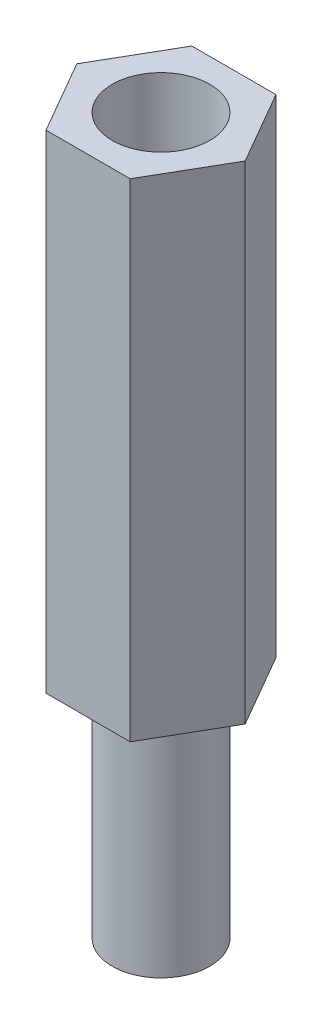
ISO-10303-21;
HEADER;
FILE_DESCRIPTION(('STEP AP214'),'2;1');
FILE_NAME('part.step','',(''),(''),'','','');
FILE_SCHEMA(('AUTOMOTIVE_DESIGN { 1 0 10303 214 1 1 1 1 }'));
ENDSEC;
DATA;
#1=APPLICATION_CONTEXT('core data for automotive mechanical design processes');
#2=APPLICATION_PROTOCOL_DEFINITION('international standard','automotive_design',2000,#1);
#3=PRODUCT_CONTEXT('',#1,'mechanical');
#4=PRODUCT('Part','Part','',(#3));
#5=PRODUCT_RELATED_PRODUCT_CATEGORY('part','',(#4));
#6=PRODUCT_DEFINITION_FORMATION('','',#4);
#7=PRODUCT_DEFINITION_CONTEXT('part definition',#1,'design');
#8=PRODUCT_DEFINITION('design','',#6,#7);
#9=PRODUCT_DEFINITION_SHAPE('','',#8);
#10=(LENGTH_UNIT() NAMED_UNIT(*) SI_UNIT(.MILLI.,.METRE.));
#11=(NAMED_UNIT(*) PLANE_ANGLE_UNIT() SI_UNIT($,.RADIAN.));
#12=(NAMED_UNIT(*) SI_UNIT($,.STERADIAN.) SOLID_ANGLE_UNIT());
#13=UNCERTAINTY_MEASURE_WITH_UNIT(LENGTH_MEASURE(1.E-05),#10,'distance_accuracy_value','');
#14=(GEOMETRIC_REPRESENTATION_CONTEXT(3) GLOBAL_UNCERTAINTY_ASSIGNED_CONTEXT((#13)) GLOBAL_UNIT_ASSIGNED_CONTEXT((#10,
#11,#12)) REPRESENTATION_CONTEXT('',''));
#15=CARTESIAN_POINT('',(0.,0.,0.));
#16=DIRECTION('',(0.,0.,1.));
#17=DIRECTION('',(1.,0.,0.));
#18=AXIS2_PLACEMENT_3D('',#15,#16,#17);
#19=CARTESIAN_POINT('',(0.,-7.,0.));
#20=DIRECTION('',(0.,1.,0.));
#21=DIRECTION('',(0.,0.,1.));
#22=AXIS2_PLACEMENT_3D('',#19,#20,#21);
#23=CYLINDRICAL_SURFACE('',#22,1.5);
#24=CARTESIAN_POINT('',(0.,-7.,0.));
#25=DIRECTION('',(0.,-1.,0.));
#26=DIRECTION('',(0.,0.,-1.));
#27=AXIS2_PLACEMENT_3D('',#24,#25,#26);
#28=CIRCLE('',#27,1.5);
#29=CARTESIAN_POINT('',(0.,-7.,-1.5));
#30=VERTEX_POINT('',#29);
#31=EDGE_CURVE('E11',#30,#30,#28,.T.);
#32=ORIENTED_EDGE('',*,*,#31,.F.);
#33=EDGE_LOOP('',(#32));
#34=FACE_BOUND('',#33,.T.);
#35=CARTESIAN_POINT('',(0.,0.,0.));
#36=DIRECTION('',(0.,-1.,0.));
#37=DIRECTION('',(0.,0.,-1.));
#38=AXIS2_PLACEMENT_3D('',#35,#36,#37);
#39=CIRCLE('',#38,1.5);
#40=CARTESIAN_POINT('',(0.,0.,-1.5));
#41=VERTEX_POINT('',#40);
#42=EDGE_CURVE('E44',#41,#41,#39,.T.);
#43=ORIENTED_EDGE('',*,*,#42,.T.);
#44=EDGE_LOOP('',(#43));
#45=FACE_BOUND('',#44,.T.);
#46=ADVANCED_FACE('F41',(#34,#45),#23,.T.);
#47=CARTESIAN_POINT('',(0.,-7.,0.));
#48=DIRECTION('',(0.,-1.,0.));
#49=DIRECTION('',(0.,0.,-1.));
#50=AXIS2_PLACEMENT_3D('',#47,#48,#49);
#51=PLANE('',#50);
#52=ORIENTED_EDGE('',*,*,#31,.T.);
#53=EDGE_LOOP('',(#52));
#54=FACE_BOUND('',#53,.T.);
#55=ADVANCED_FACE('F56',(#54),#51,.T.);
#56=CARTESIAN_POINT('',(0.,0.,0.));
#57=DIRECTION('',(0.,-1.,0.));
#58=DIRECTION('',(0.,0.,-1.));
#59=AXIS2_PLACEMENT_3D('',#56,#57,#58);
#60=PLANE('',#59);
#61=ORIENTED_EDGE('',*,*,#42,.F.);
#62=EDGE_LOOP('',(#61));
#63=FACE_BOUND('',#62,.T.);
#64=ADVANCED_FACE('F54',(#63),#60,.F.);
#65=CLOSED_SHELL('',(#46,#55,#64));
#66=MANIFOLD_SOLID_BREP('B2',#65);
#67=CARTESIAN_POINT('',(0.,15.,0.));
#68=DIRECTION('',(0.,1.,0.));
#69=DIRECTION('',(0.,0.,1.));
#70=AXIS2_PLACEMENT_3D('',#67,#68,#69);
#71=PLANE('',#70);
#72=DIRECTION('',(-1.,0.,0.));
#73=VECTOR('',#72,1.);
#74=CARTESIAN_POINT('',(1.29456066259683,15.,-2.24224484109774));
#75=LINE('',#74,#73);
#76=CARTESIAN_POINT('',(1.29456066259683,15.,-2.24224484109774));
#77=VERTEX_POINT('',#76);
#78=CARTESIAN_POINT('',(-1.29456066259683,15.,-2.24224484109774));
#79=VERTEX_POINT('',#78);
#80=EDGE_CURVE('E178',#77,#79,#75,.T.);
#81=ORIENTED_EDGE('',*,*,#80,.T.);
#82=DIRECTION('',(-0.5,0.,0.866025403784439));
#83=VECTOR('',#82,1.);
#84=CARTESIAN_POINT('',(-1.29456066259683,15.,-2.24224484109774));
#85=LINE('',#84,#83);
#86=CARTESIAN_POINT('',(-2.58912132519366,15.,0.));
#87=VERTEX_POINT('',#86);
#88=EDGE_CURVE('E136',#79,#87,#85,.T.);
#89=ORIENTED_EDGE('',*,*,#88,.T.);
#90=DIRECTION('',(0.5,0.,0.866025403784439));
#91=VECTOR('',#90,1.);
#92=CARTESIAN_POINT('',(-2.58912132519366,15.,0.));
#93=LINE('',#92,#91);
#94=CARTESIAN_POINT('',(-1.29456066259683,15.,2.24224484109774));
#95=VERTEX_POINT('',#94);
#96=EDGE_CURVE('E149',#87,#95,#93,.T.);
#97=ORIENTED_EDGE('',*,*,#96,.T.);
#98=DIRECTION('',(1.,0.,0.));
#99=VECTOR('',#98,1.);
#100=CARTESIAN_POINT('',(-1.29456066259683,15.,2.24224484109774));
#101=LINE('',#100,#99);
#102=CARTESIAN_POINT('',(1.29456066259683,15.,2.24224484109774));
#103=VERTEX_POINT('',#102);
#104=EDGE_CURVE('E143',#95,#103,#101,.T.);
#105=ORIENTED_EDGE('',*,*,#104,.T.);
#106=DIRECTION('',(0.5,0.,-0.866025403784439));
#107=VECTOR('',#106,1.);
#108=CARTESIAN_POINT('',(1.29456066259683,15.,2.24224484109774));
#109=LINE('',#108,#107);
#110=CARTESIAN_POINT('',(2.58912132519366,15.,0.));
#111=VERTEX_POINT('',#110);
#112=EDGE_CURVE('E147',#103,#111,#109,.T.);
#113=ORIENTED_EDGE('',*,*,#112,.T.);
#114=DIRECTION('',(-0.5,0.,-0.866025403784439));
#115=VECTOR('',#114,1.);
#116=CARTESIAN_POINT('',(2.58912132519366,15.,0.));
#117=LINE('',#116,#115);
#118=EDGE_CURVE('E99',#111,#77,#117,.T.);
#119=ORIENTED_EDGE('',*,*,#118,.T.);
#120=EDGE_LOOP('',(#81,#89,#97,#105,#113,#119));
#121=FACE_BOUND('',#120,.T.);
#122=CARTESIAN_POINT('',(0.,15.,0.));
#123=DIRECTION('',(0.,1.,0.));
#124=DIRECTION('',(0.,0.,1.));
#125=AXIS2_PLACEMENT_3D('',#122,#123,#124);
#126=CIRCLE('',#125,1.5);
#127=CARTESIAN_POINT('',(0.,15.,1.5));
#128=VERTEX_POINT('',#127);
#129=EDGE_CURVE('E171',#128,#128,#126,.T.);
#130=ORIENTED_EDGE('',*,*,#129,.F.);
#131=EDGE_LOOP('',(#130));
#132=FACE_BOUND('',#131,.T.);
#133=ADVANCED_FACE('F82',(#121,#132),#71,.T.);
#134=CARTESIAN_POINT('',(0.,0.,0.));
#135=DIRECTION('',(0.,1.,0.));
#136=DIRECTION('',(0.,0.,1.));
#137=AXIS2_PLACEMENT_3D('',#134,#135,#136);
#138=PLANE('',#137);
#139=DIRECTION('',(-1.,0.,0.));
#140=VECTOR('',#139,1.);
#141=CARTESIAN_POINT('',(1.29456066259683,0.,-2.24224484109774));
#142=LINE('',#141,#140);
#143=CARTESIAN_POINT('',(1.29456066259683,0.,-2.24224484109774));
#144=VERTEX_POINT('',#143);
#145=CARTESIAN_POINT('',(-1.29456066259683,0.,-2.24224484109774));
#146=VERTEX_POINT('',#145);
#147=EDGE_CURVE('E167',#144,#146,#142,.T.);
#148=ORIENTED_EDGE('',*,*,#147,.F.);
#149=DIRECTION('',(-0.5,0.,-0.866025403784439));
#150=VECTOR('',#149,1.);
#151=CARTESIAN_POINT('',(2.58912132519366,0.,0.));
#152=LINE('',#151,#150);
#153=CARTESIAN_POINT('',(2.58912132519366,0.,0.));
#154=VERTEX_POINT('',#153);
#155=EDGE_CURVE('E128',#154,#144,#152,.T.);
#156=ORIENTED_EDGE('',*,*,#155,.F.);
#157=DIRECTION('',(0.5,0.,-0.866025403784439));
#158=VECTOR('',#157,1.);
#159=CARTESIAN_POINT('',(1.29456066259683,0.,2.24224484109774));
#160=LINE('',#159,#158);
#161=CARTESIAN_POINT('',(1.29456066259683,0.,2.24224484109774));
#162=VERTEX_POINT('',#161);
#163=EDGE_CURVE('E122',#162,#154,#160,.T.);
#164=ORIENTED_EDGE('',*,*,#163,.F.);
#165=DIRECTION('',(1.,0.,0.));
#166=VECTOR('',#165,1.);
#167=CARTESIAN_POINT('',(-1.29456066259683,0.,2.24224484109774));
#168=LINE('',#167,#166);
#169=CARTESIAN_POINT('',(-1.29456066259683,0.,2.24224484109774));
#170=VERTEX_POINT('',#169);
#171=EDGE_CURVE('E157',#170,#162,#168,.T.);
#172=ORIENTED_EDGE('',*,*,#171,.F.);
#173=DIRECTION('',(0.5,0.,0.866025403784439));
#174=VECTOR('',#173,1.);
#175=CARTESIAN_POINT('',(-2.58912132519366,0.,0.));
#176=LINE('',#175,#174);
#177=CARTESIAN_POINT('',(-2.58912132519366,0.,0.));
#178=VERTEX_POINT('',#177);
#179=EDGE_CURVE('E173',#178,#170,#176,.T.);
#180=ORIENTED_EDGE('',*,*,#179,.F.);
#181=DIRECTION('',(-0.5,0.,0.866025403784439));
#182=VECTOR('',#181,1.);
#183=CARTESIAN_POINT('',(-1.29456066259683,0.,-2.24224484109774));
#184=LINE('',#183,#182);
#185=EDGE_CURVE('E170',#146,#178,#184,.T.);
#186=ORIENTED_EDGE('',*,*,#185,.F.);
#187=EDGE_LOOP('',(#148,#156,#164,#172,#180,#186));
#188=FACE_BOUND('',#187,.T.);
#189=CARTESIAN_POINT('',(0.,0.,0.));
#190=DIRECTION('',(0.,1.,0.));
#191=DIRECTION('',(0.,0.,1.));
#192=AXIS2_PLACEMENT_3D('',#189,#190,#191);
#193=CIRCLE('',#192,1.5);
#194=CARTESIAN_POINT('',(0.,0.,1.5));
#195=VERTEX_POINT('',#194);
#196=EDGE_CURVE('E271',#195,#195,#193,.T.);
#197=ORIENTED_EDGE('',*,*,#196,.T.);
#198=EDGE_LOOP('',(#197));
#199=FACE_BOUND('',#198,.T.);
#200=ADVANCED_FACE('F187',(#188,#199),#138,.F.);
#201=CARTESIAN_POINT('',(1.29456066259683,15.,-2.24224484109774));
#202=DIRECTION('',(0.,0.,1.));
#203=DIRECTION('',(1.,0.,0.));
#204=AXIS2_PLACEMENT_3D('',#201,#202,#203);
#205=PLANE('',#204);
#206=ORIENTED_EDGE('',*,*,#147,.T.);
#207=DIRECTION('',(0.,-1.,0.));
#208=VECTOR('',#207,1.);
#209=CARTESIAN_POINT('',(-1.29456066259683,15.,-2.24224484109774));
#210=LINE('',#209,#208);
#211=EDGE_CURVE('E39',#79,#146,#210,.T.);
#212=ORIENTED_EDGE('',*,*,#211,.F.);
#213=ORIENTED_EDGE('',*,*,#80,.F.);
#214=DIRECTION('',(0.,-1.,0.));
#215=VECTOR('',#214,1.);
#216=CARTESIAN_POINT('',(1.29456066259683,15.,-2.24224484109774));
#217=LINE('',#216,#215);
#218=EDGE_CURVE('E163',#77,#144,#217,.T.);
#219=ORIENTED_EDGE('',*,*,#218,.T.);
#220=EDGE_LOOP('',(#206,#212,#213,#219));
#221=FACE_BOUND('',#220,.T.);
#222=ADVANCED_FACE('F84',(#221),#205,.F.);
#223=CARTESIAN_POINT('',(-1.29456066259683,15.,-2.24224484109774));
#224=DIRECTION('',(0.866025403784439,0.,0.5));
#225=DIRECTION('',(0.5,0.,-0.866025403784439));
#226=AXIS2_PLACEMENT_3D('',#223,#224,#225);
#227=PLANE('',#226);
#228=ORIENTED_EDGE('',*,*,#185,.T.);
#229=DIRECTION('',(0.,-1.,0.));
#230=VECTOR('',#229,1.);
#231=CARTESIAN_POINT('',(-2.58912132519366,15.,0.));
#232=LINE('',#231,#230);
#233=EDGE_CURVE('E91',#87,#178,#232,.T.);
#234=ORIENTED_EDGE('',*,*,#233,.F.);
#235=ORIENTED_EDGE('',*,*,#88,.F.);
#236=ORIENTED_EDGE('',*,*,#211,.T.);
#237=EDGE_LOOP('',(#228,#234,#235,#236));
#238=FACE_BOUND('',#237,.T.);
#239=ADVANCED_FACE('F212',(#238),#227,.F.);
#240=CARTESIAN_POINT('',(-2.58912132519366,15.,0.));
#241=DIRECTION('',(0.866025403784439,0.,-0.5));
#242=DIRECTION('',(-0.5,0.,-0.866025403784439));
#243=AXIS2_PLACEMENT_3D('',#240,#241,#242);
#244=PLANE('',#243);
#245=ORIENTED_EDGE('',*,*,#179,.T.);
#246=DIRECTION('',(0.,-1.,0.));
#247=VECTOR('',#246,1.);
#248=CARTESIAN_POINT('',(-1.29456066259683,15.,2.24224484109774));
#249=LINE('',#248,#247);
#250=EDGE_CURVE('E158',#95,#170,#249,.T.);
#251=ORIENTED_EDGE('',*,*,#250,.F.);
#252=ORIENTED_EDGE('',*,*,#96,.F.);
#253=ORIENTED_EDGE('',*,*,#233,.T.);
#254=EDGE_LOOP('',(#245,#251,#252,#253));
#255=FACE_BOUND('',#254,.T.);
#256=ADVANCED_FACE('F184',(#255),#244,.F.);
#257=CARTESIAN_POINT('',(-1.29456066259683,15.,2.24224484109774));
#258=DIRECTION('',(0.,0.,-1.));
#259=DIRECTION('',(-1.,0.,0.));
#260=AXIS2_PLACEMENT_3D('',#257,#258,#259);
#261=PLANE('',#260);
#262=ORIENTED_EDGE('',*,*,#171,.T.);
#263=DIRECTION('',(0.,-1.,0.));
#264=VECTOR('',#263,1.);
#265=CARTESIAN_POINT('',(1.29456066259683,15.,2.24224484109774));
#266=LINE('',#265,#264);
#267=EDGE_CURVE('E154',#103,#162,#266,.T.);
#268=ORIENTED_EDGE('',*,*,#267,.F.);
#269=ORIENTED_EDGE('',*,*,#104,.F.);
#270=ORIENTED_EDGE('',*,*,#250,.T.);
#271=EDGE_LOOP('',(#262,#268,#269,#270));
#272=FACE_BOUND('',#271,.T.);
#273=ADVANCED_FACE('F155',(#272),#261,.F.);
#274=CARTESIAN_POINT('',(1.29456066259683,15.,2.24224484109774));
#275=DIRECTION('',(-0.866025403784438,0.,-0.5));
#276=DIRECTION('',(-0.5,0.,0.866025403784439));
#277=AXIS2_PLACEMENT_3D('',#274,#275,#276);
#278=PLANE('',#277);
#279=ORIENTED_EDGE('',*,*,#163,.T.);
#280=DIRECTION('',(0.,-1.,0.));
#281=VECTOR('',#280,1.);
#282=CARTESIAN_POINT('',(2.58912132519366,15.,0.));
#283=LINE('',#282,#281);
#284=EDGE_CURVE('E159',#111,#154,#283,.T.);
#285=ORIENTED_EDGE('',*,*,#284,.F.);
#286=ORIENTED_EDGE('',*,*,#112,.F.);
#287=ORIENTED_EDGE('',*,*,#267,.T.);
#288=EDGE_LOOP('',(#279,#285,#286,#287));
#289=FACE_BOUND('',#288,.T.);
#290=ADVANCED_FACE('F161',(#289),#278,.F.);
#291=CARTESIAN_POINT('',(2.58912132519366,15.,0.));
#292=DIRECTION('',(-0.866025403784439,0.,0.5));
#293=DIRECTION('',(0.5,0.,0.866025403784439));
#294=AXIS2_PLACEMENT_3D('',#291,#292,#293);
#295=PLANE('',#294);
#296=ORIENTED_EDGE('',*,*,#155,.T.);
#297=ORIENTED_EDGE('',*,*,#218,.F.);
#298=ORIENTED_EDGE('',*,*,#118,.F.);
#299=ORIENTED_EDGE('',*,*,#284,.T.);
#300=EDGE_LOOP('',(#296,#297,#298,#299));
#301=FACE_BOUND('',#300,.T.);
#302=ADVANCED_FACE('F192',(#301),#295,.F.);
#303=CARTESIAN_POINT('',(0.,15.,0.));
#304=DIRECTION('',(0.,-1.,0.));
#305=DIRECTION('',(0.,0.,-1.));
#306=AXIS2_PLACEMENT_3D('',#303,#304,#305);
#307=CYLINDRICAL_SURFACE('',#306,1.5);
#308=ORIENTED_EDGE('',*,*,#129,.T.);
#309=EDGE_LOOP('',(#308));
#310=FACE_BOUND('',#309,.T.);
#311=ORIENTED_EDGE('',*,*,#196,.F.);
#312=EDGE_LOOP('',(#311));
#313=FACE_BOUND('',#312,.T.);
#314=ADVANCED_FACE('F194',(#310,#313),#307,.F.);
#315=CLOSED_SHELL('',(#133,#200,#222,#239,#256,#273,#290,#302,#314));
#316=MANIFOLD_SOLID_BREP('B6',#315);
#317=ADVANCED_BREP_SHAPE_REPRESENTATION('',(#18,#66,#316),#14);
#318=SHAPE_DEFINITION_REPRESENTATION(#9,#317);
ENDSEC;
END-ISO-10303-21;
